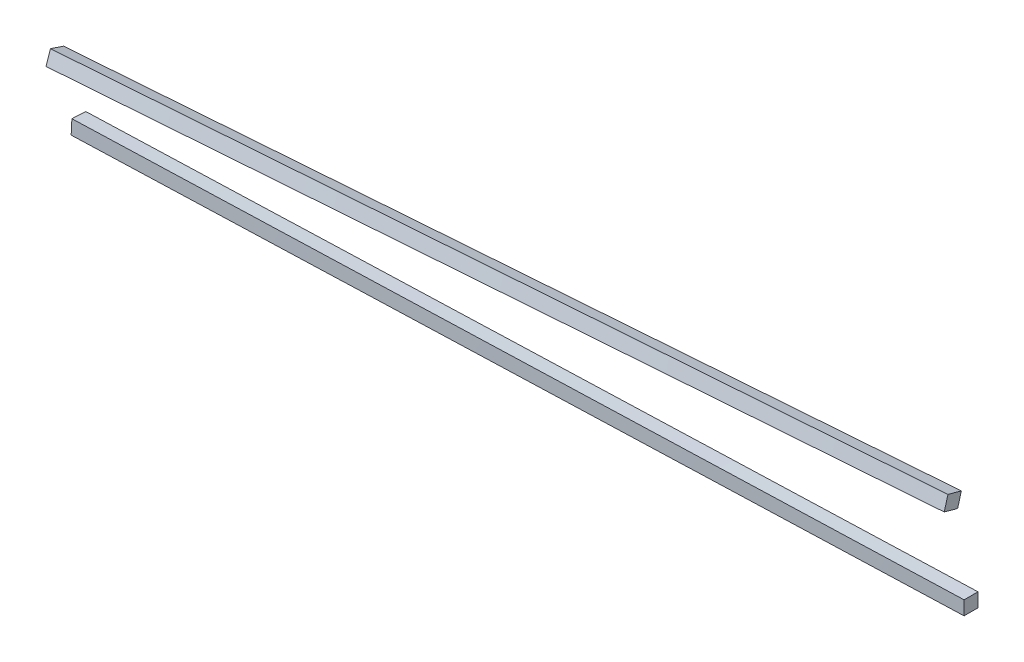
ISO-10303-21;
HEADER;
FILE_DESCRIPTION(('STEP AP214'),'2;1');
FILE_NAME('part.step','',(''),(''),'','','');
FILE_SCHEMA(('AUTOMOTIVE_DESIGN { 1 0 10303 214 1 1 1 1 }'));
ENDSEC;
DATA;
#1=APPLICATION_CONTEXT('core data for automotive mechanical design processes');
#2=APPLICATION_PROTOCOL_DEFINITION('international standard','automotive_design',2000,#1);
#3=PRODUCT_CONTEXT('',#1,'mechanical');
#4=PRODUCT('Part','Part','',(#3));
#5=PRODUCT_RELATED_PRODUCT_CATEGORY('part','',(#4));
#6=PRODUCT_DEFINITION_FORMATION('','',#4);
#7=PRODUCT_DEFINITION_CONTEXT('part definition',#1,'design');
#8=PRODUCT_DEFINITION('design','',#6,#7);
#9=PRODUCT_DEFINITION_SHAPE('','',#8);
#10=(LENGTH_UNIT() NAMED_UNIT(*) SI_UNIT(.MILLI.,.METRE.));
#11=(NAMED_UNIT(*) PLANE_ANGLE_UNIT() SI_UNIT($,.RADIAN.));
#12=(NAMED_UNIT(*) SI_UNIT($,.STERADIAN.) SOLID_ANGLE_UNIT());
#13=UNCERTAINTY_MEASURE_WITH_UNIT(LENGTH_MEASURE(1.E-05),#10,'distance_accuracy_value','');
#14=(GEOMETRIC_REPRESENTATION_CONTEXT(3) GLOBAL_UNCERTAINTY_ASSIGNED_CONTEXT((#13)) GLOBAL_UNIT_ASSIGNED_CONTEXT((#10,
#11,#12)) REPRESENTATION_CONTEXT('',''));
#15=CARTESIAN_POINT('',(0.,0.,0.));
#16=DIRECTION('',(0.,0.,1.));
#17=DIRECTION('',(1.,0.,0.));
#18=AXIS2_PLACEMENT_3D('',#15,#16,#17);
#19=CARTESIAN_POINT('',(-301.244,0.,0.));
#20=DIRECTION('',(1.,0.,0.));
#21=DIRECTION('',(0.,0.,-1.));
#22=AXIS2_PLACEMENT_3D('',#19,#20,#21);
#23=PLANE('',#22);
#24=DIRECTION('',(0.,0.998681754470149,-0.0513298479291129));
#25=VECTOR('',#24,1.);
#26=CARTESIAN_POINT('',(-301.244,-54.3131968202896,-76.6565977528262));
#27=LINE('',#26,#25);
#28=CARTESIAN_POINT('',(-301.244,-54.3131968202896,-76.6565977528262));
#29=VERTEX_POINT('',#28);
#30=CARTESIAN_POINT('',(-301.244,-49.4935586732166,-76.9043155989321));
#31=VERTEX_POINT('',#30);
#32=EDGE_CURVE('E145',#29,#31,#27,.T.);
#33=ORIENTED_EDGE('',*,*,#32,.F.);
#34=DIRECTION('',(0.,0.0513298479291094,0.998681754470149));
#35=VECTOR('',#34,1.);
#36=CARTESIAN_POINT('',(-301.244,-54.3131968202896,-76.6565977528262));
#37=LINE('',#36,#35);
#38=CARTESIAN_POINT('',(-301.244,-54.0654789741837,-71.8369596057533));
#39=VERTEX_POINT('',#38);
#40=EDGE_CURVE('E13',#29,#39,#37,.T.);
#41=ORIENTED_EDGE('',*,*,#40,.T.);
#42=DIRECTION('',(0.,0.998681754470149,-0.0513298479291069));
#43=VECTOR('',#42,1.);
#44=CARTESIAN_POINT('',(-301.244,-54.0654789741837,-71.8369596057533));
#45=LINE('',#44,#43);
#46=CARTESIAN_POINT('',(-301.244,-49.2458408271109,-72.0846774518592));
#47=VERTEX_POINT('',#46);
#48=EDGE_CURVE('E76',#39,#47,#45,.T.);
#49=ORIENTED_EDGE('',*,*,#48,.T.);
#50=DIRECTION('',(0.,0.0513298479290573,0.998681754470151));
#51=VECTOR('',#50,1.);
#52=CARTESIAN_POINT('',(-301.244,-49.4935586732166,-76.9043155989321));
#53=LINE('',#52,#51);
#54=EDGE_CURVE('E142',#31,#47,#53,.T.);
#55=ORIENTED_EDGE('',*,*,#54,.F.);
#56=EDGE_LOOP('',(#33,#41,#49,#55));
#57=FACE_BOUND('',#56,.T.);
#58=ADVANCED_FACE('F65',(#57),#23,.F.);
#59=CARTESIAN_POINT('',(0.,0.,0.));
#60=DIRECTION('',(-1.,0.,0.));
#61=DIRECTION('',(0.,0.,1.));
#62=AXIS2_PLACEMENT_3D('',#59,#60,#61);
#63=PLANE('',#62);
#64=DIRECTION('',(0.,0.999999249764561,-0.00122493686179626));
#65=VECTOR('',#64,1.);
#66=CARTESIAN_POINT('',(0.,-52.3639366169535,-80.6060154079807));
#67=LINE('',#66,#65);
#68=CARTESIAN_POINT('',(0.,-52.3639366169535,-80.6060154079807));
#69=VERTEX_POINT('',#68);
#70=CARTESIAN_POINT('',(0.,-47.5379402375898,-80.6119269532758));
#71=VERTEX_POINT('',#70);
#72=EDGE_CURVE('E115',#69,#71,#67,.T.);
#73=ORIENTED_EDGE('',*,*,#72,.F.);
#74=DIRECTION('',(0.,-0.00122493686179193,-0.999999249764561));
#75=VECTOR('',#74,1.);
#76=CARTESIAN_POINT('',(0.,-52.3639366169535,-80.6060154079807));
#77=LINE('',#76,#75);
#78=CARTESIAN_POINT('',(0.,-52.3698481622485,-85.4320117873445));
#79=VERTEX_POINT('',#78);
#80=EDGE_CURVE('E249',#69,#79,#77,.T.);
#81=ORIENTED_EDGE('',*,*,#80,.T.);
#82=DIRECTION('',(0.,0.999999249764561,-0.00122493686179337));
#83=VECTOR('',#82,1.);
#84=CARTESIAN_POINT('',(0.,-52.3698481622485,-85.4320117873445));
#85=LINE('',#84,#83);
#86=CARTESIAN_POINT('',(0.,-47.5438517828847,-85.4379233326396));
#87=VERTEX_POINT('',#86);
#88=EDGE_CURVE('E117',#79,#87,#85,.T.);
#89=ORIENTED_EDGE('',*,*,#88,.T.);
#90=DIRECTION('',(0.,-0.00122493686178187,-0.999999249764561));
#91=VECTOR('',#90,1.);
#92=CARTESIAN_POINT('',(0.,-47.5379402375898,-80.6119269532758));
#93=LINE('',#92,#91);
#94=EDGE_CURVE('E111',#71,#87,#93,.T.);
#95=ORIENTED_EDGE('',*,*,#94,.F.);
#96=EDGE_LOOP('',(#73,#81,#89,#95));
#97=FACE_BOUND('',#96,.T.);
#98=ADVANCED_FACE('F114',(#97),#63,.F.);
#99=CARTESIAN_POINT('',(0.,-47.5438517828847,-85.4379233326396));
#100=CARTESIAN_POINT('',(-301.244,-49.4935586732166,-76.9043155989321));
#101=CARTESIAN_POINT('',(0.,-48.3481845127787,-85.4369380750904));
#102=CARTESIAN_POINT('',(-301.244,-50.2968316977287,-76.8630292912478));
#103=CARTESIAN_POINT('',(0.,-49.1525172426727,-85.4359528175412));
#104=CARTESIAN_POINT('',(-301.244,-51.1001047222409,-76.8217429835635));
#105=CARTESIAN_POINT('',(0.,-50.7611827024606,-85.4339823024429));
#106=CARTESIAN_POINT('',(-301.244,-52.7066507712652,-76.7391703681949));
#107=CARTESIAN_POINT('',(0.,-51.5655154323546,-85.4329970448937));
#108=CARTESIAN_POINT('',(-301.244,-53.5099237957774,-76.6978840605105));
#109=CARTESIAN_POINT('',(0.,-52.3698481622485,-85.4320117873445));
#110=CARTESIAN_POINT('',(-301.244,-54.3131968202896,-76.6565977528262));
#111=B_SPLINE_SURFACE_WITH_KNOTS('',3,1,((#99,#100),(#101,#102),(#103,#104),(#105,#106),(#107,
#108),(#109,#110)),.UNSPECIFIED.,.F.,.F.,.F.,(4,2,4),(2,2),(0.,0.5,1.),(0.,1.),.UNSPECIFIED.);
#112=DIRECTION('',(-0.999555193249879,-0.00644820890520686,0.0291176278070954));
#113=VECTOR('',#112,1.);
#114=CARTESIAN_POINT('',(-150.622,-53.341522491269,-81.0443047700854));
#115=LINE('',#114,#113);
#116=EDGE_CURVE('E84',#79,#29,#115,.T.);
#117=DIRECTION('',(0.999578087821169,0.00646945428041606,-0.0283159409006493));
#118=VECTOR('',#117,1.);
#119=CARTESIAN_POINT('',(-150.622,-48.5187052280507,-81.1711194657858));
#120=LINE('',#119,#118);
#121=EDGE_CURVE('E160',#31,#87,#120,.T.);
#122=ORIENTED_EDGE('',*,*,#88,.F.);
#123=ORIENTED_EDGE('',*,*,#116,.T.);
#124=ORIENTED_EDGE('',*,*,#32,.T.);
#125=ORIENTED_EDGE('',*,*,#121,.T.);
#126=EDGE_LOOP('',(#122,#123,#124,#125));
#127=FACE_BOUND('',#126,.T.);
#128=ADVANCED_FACE('F201',(#127),#111,.T.);
#129=CARTESIAN_POINT('',(0.,-52.3698481622485,-85.4320117873445));
#130=CARTESIAN_POINT('',(-301.244,-54.3131968202896,-76.6565977528262));
#131=CARTESIAN_POINT('',(0.,-52.3688629046993,-84.6276790574505));
#132=CARTESIAN_POINT('',(-301.244,-54.2719105126053,-75.8533247283141));
#133=CARTESIAN_POINT('',(0.,-52.3678776471502,-83.8233463275565));
#134=CARTESIAN_POINT('',(-301.244,-54.2306242049209,-75.0500517038019));
#135=CARTESIAN_POINT('',(0.,-52.3659071320518,-82.2146808677686));
#136=CARTESIAN_POINT('',(-301.244,-54.1480515895523,-73.4435056547776));
#137=CARTESIAN_POINT('',(0.,-52.3649218745027,-81.4103481378746));
#138=CARTESIAN_POINT('',(-301.244,-54.106765281868,-72.6402326302655));
#139=CARTESIAN_POINT('',(0.,-52.3639366169535,-80.6060154079807));
#140=CARTESIAN_POINT('',(-301.244,-54.0654789741837,-71.8369596057533));
#141=B_SPLINE_SURFACE_WITH_KNOTS('',3,1,((#129,#130),(#131,#132),(#133,#134),(#135,#136),(#137,
#138),(#139,#140)),.UNSPECIFIED.,.F.,.F.,.F.,(4,2,4),(2,2),(0.,0.5,1.),(0.,1.),.UNSPECIFIED.);
#142=DIRECTION('',(-0.999560656696797,-0.00564590430345644,0.0290966896478778));
#143=VECTOR('',#142,1.);
#144=CARTESIAN_POINT('',(-150.622,-53.2147077955686,-76.221487506867));
#145=LINE('',#144,#143);
#146=EDGE_CURVE('E134',#69,#39,#145,.T.);
#147=ORIENTED_EDGE('',*,*,#80,.F.);
#148=ORIENTED_EDGE('',*,*,#146,.T.);
#149=ORIENTED_EDGE('',*,*,#40,.F.);
#150=ORIENTED_EDGE('',*,*,#116,.F.);
#151=EDGE_LOOP('',(#147,#148,#149,#150));
#152=FACE_BOUND('',#151,.T.);
#153=ADVANCED_FACE('F172',(#152),#141,.T.);
#154=CARTESIAN_POINT('',(0.,-47.5379402375898,-80.6119269532758));
#155=CARTESIAN_POINT('',(-301.244,-49.2458408271109,-72.0846774518592));
#156=CARTESIAN_POINT('',(0.,-47.5389254951389,-81.4162596831702));
#157=CARTESIAN_POINT('',(-301.244,-49.2871271347952,-72.8879504763713));
#158=CARTESIAN_POINT('',(0.,-47.5399107526881,-82.2205924130644));
#159=CARTESIAN_POINT('',(-301.244,-49.3284134424795,-73.6912235008835));
#160=CARTESIAN_POINT('',(0.,-47.5418812677864,-83.8292578728523));
#161=CARTESIAN_POINT('',(-301.244,-49.410986057848,-75.2977695499078));
#162=CARTESIAN_POINT('',(0.,-47.5428665253356,-84.6335906027461));
#163=CARTESIAN_POINT('',(-301.244,-49.4522723655323,-76.10104257442));
#164=CARTESIAN_POINT('',(0.,-47.5438517828847,-85.4379233326396));
#165=CARTESIAN_POINT('',(-301.244,-49.4935586732166,-76.9043155989321));
#166=B_SPLINE_SURFACE_WITH_KNOTS('',3,1,((#154,#155),(#156,#157),(#158,#159),(#160,#161),(#162,
#163),(#164,#165)),.UNSPECIFIED.,.F.,.F.,.F.,(4,2,4),(2,2),(0.,0.5,1.),(0.,1.),.UNSPECIFIED.);
#167=DIRECTION('',(-0.999583551643514,-0.00566713141880874,0.028294997883365));
#168=VECTOR('',#167,1.);
#169=CARTESIAN_POINT('',(-150.622,-48.3918905323504,-76.3483022025675));
#170=LINE('',#169,#168);
#171=EDGE_CURVE('E132',#71,#47,#170,.T.);
#172=ORIENTED_EDGE('',*,*,#94,.T.);
#173=ORIENTED_EDGE('',*,*,#121,.F.);
#174=ORIENTED_EDGE('',*,*,#54,.T.);
#175=ORIENTED_EDGE('',*,*,#171,.F.);
#176=EDGE_LOOP('',(#172,#173,#174,#175));
#177=FACE_BOUND('',#176,.T.);
#178=ADVANCED_FACE('F141',(#177),#166,.T.);
#179=CARTESIAN_POINT('',(0.,-52.3639366169535,-80.6060154079807));
#180=CARTESIAN_POINT('',(-301.244,-54.0654789741837,-71.8369596057533));
#181=CARTESIAN_POINT('',(0.,-51.5596038870595,-80.6070006655299));
#182=CARTESIAN_POINT('',(-301.244,-53.2622059496716,-71.8782459134376));
#183=CARTESIAN_POINT('',(0.,-50.7552711571656,-80.6079859230791));
#184=CARTESIAN_POINT('',(-301.244,-52.4589329251595,-71.9195322211219));
#185=CARTESIAN_POINT('',(0.,-49.1466056973777,-80.6099564381774));
#186=CARTESIAN_POINT('',(-301.244,-50.8523868761353,-72.0021048364905));
#187=CARTESIAN_POINT('',(0.,-48.3422729674837,-80.6109416957266));
#188=CARTESIAN_POINT('',(-301.244,-50.0491138516231,-72.0433911441748));
#189=CARTESIAN_POINT('',(0.,-47.5379402375898,-80.6119269532758));
#190=CARTESIAN_POINT('',(-301.244,-49.2458408271109,-72.0846774518592));
#191=B_SPLINE_SURFACE_WITH_KNOTS('',3,1,((#179,#180),(#181,#182),(#183,#184),(#185,#186),(#187,
#188),(#189,#190)),.UNSPECIFIED.,.F.,.F.,.F.,(4,2,4),(2,2),(0.,0.5,1.),(0.,1.),.UNSPECIFIED.);
#192=ORIENTED_EDGE('',*,*,#72,.T.);
#193=ORIENTED_EDGE('',*,*,#171,.T.);
#194=ORIENTED_EDGE('',*,*,#48,.F.);
#195=ORIENTED_EDGE('',*,*,#146,.F.);
#196=EDGE_LOOP('',(#192,#193,#194,#195));
#197=FACE_BOUND('',#196,.T.);
#198=ADVANCED_FACE('F131',(#197),#191,.T.);
#199=CLOSED_SHELL('',(#58,#98,#128,#153,#178,#198));
#200=MANIFOLD_SOLID_BREP('B2',#199);
#201=CARTESIAN_POINT('',(-301.244,0.,0.));
#202=DIRECTION('',(1.,0.,0.));
#203=DIRECTION('',(0.,0.,-1.));
#204=AXIS2_PLACEMENT_3D('',#201,#202,#203);
#205=PLANE('',#204);
#206=DIRECTION('',(0.,0.948597586448129,-0.316484784760317));
#207=VECTOR('',#206,1.);
#208=CARTESIAN_POINT('',(-301.244,-30.5643098408637,-67.6798509574859));
#209=LINE('',#208,#207);
#210=CARTESIAN_POINT('',(-301.244,-30.5643098408637,-67.6798509574859));
#211=VERTEX_POINT('',#210);
#212=CARTESIAN_POINT('',(-301.244,-25.986377888665,-69.2072065287391));
#213=VERTEX_POINT('',#212);
#214=EDGE_CURVE('E538',#211,#213,#209,.T.);
#215=ORIENTED_EDGE('',*,*,#214,.F.);
#216=DIRECTION('',(0.,0.316484784760316,0.948597586448129));
#217=VECTOR('',#216,1.);
#218=CARTESIAN_POINT('',(-301.244,-30.5643098408637,-67.6798509574859));
#219=LINE('',#218,#217);
#220=CARTESIAN_POINT('',(-301.244,-29.0369542696104,-63.1019190052872));
#221=VERTEX_POINT('',#220);
#222=EDGE_CURVE('E63',#211,#221,#219,.T.);
#223=ORIENTED_EDGE('',*,*,#222,.T.);
#224=DIRECTION('',(0.,0.948597586448129,-0.316484784760317));
#225=VECTOR('',#224,1.);
#226=CARTESIAN_POINT('',(-301.244,-29.0369542696104,-63.1019190052872));
#227=LINE('',#226,#225);
#228=CARTESIAN_POINT('',(-301.244,-24.4590223174117,-64.6292745765404));
#229=VERTEX_POINT('',#228);
#230=EDGE_CURVE('E423',#221,#229,#227,.T.);
#231=ORIENTED_EDGE('',*,*,#230,.T.);
#232=DIRECTION('',(0.,0.316484784760317,0.948597586448129));
#233=VECTOR('',#232,1.);
#234=CARTESIAN_POINT('',(-301.244,-25.986377888665,-69.2072065287391));
#235=LINE('',#234,#233);
#236=EDGE_CURVE('E465',#213,#229,#235,.T.);
#237=ORIENTED_EDGE('',*,*,#236,.F.);
#238=EDGE_LOOP('',(#215,#223,#231,#237));
#239=FACE_BOUND('',#238,.T.);
#240=ADVANCED_FACE('F413',(#239),#205,.F.);
#241=CARTESIAN_POINT('',(0.,0.,0.));
#242=DIRECTION('',(1.,0.,0.));
#243=DIRECTION('',(0.,0.,-1.));
#244=AXIS2_PLACEMENT_3D('',#241,#242,#243);
#245=PLANE('',#244);
#246=DIRECTION('',(0.,-0.264944987657992,-0.964263529080565));
#247=VECTOR('',#246,1.);
#248=CARTESIAN_POINT('',(0.,-17.6892857922132,-73.7225928427553));
#249=LINE('',#248,#247);
#250=CARTESIAN_POINT('',(0.,-17.6892857922132,-73.7225928427553));
#251=VERTEX_POINT('',#250);
#252=CARTESIAN_POINT('',(0.,-18.9679103026507,-78.3761286340981));
#253=VERTEX_POINT('',#252);
#254=EDGE_CURVE('E526',#251,#253,#249,.T.);
#255=ORIENTED_EDGE('',*,*,#254,.T.);
#256=DIRECTION('',(0.,0.964263529080565,-0.264944987657993));
#257=VECTOR('',#256,1.);
#258=CARTESIAN_POINT('',(0.,-18.9679103026507,-78.3761286340981));
#259=LINE('',#258,#257);
#260=CARTESIAN_POINT('',(0.,-14.3143745113079,-79.6547531445356));
#261=VERTEX_POINT('',#260);
#262=EDGE_CURVE('E485',#253,#261,#259,.T.);
#263=ORIENTED_EDGE('',*,*,#262,.T.);
#264=DIRECTION('',(0.,-0.264944987657993,-0.964263529080565));
#265=VECTOR('',#264,1.);
#266=CARTESIAN_POINT('',(0.,-13.0357500008704,-75.0012173531927));
#267=LINE('',#266,#265);
#268=CARTESIAN_POINT('',(0.,-13.0357500008704,-75.0012173531927));
#269=VERTEX_POINT('',#268);
#270=EDGE_CURVE('E462',#269,#261,#267,.T.);
#271=ORIENTED_EDGE('',*,*,#270,.F.);
#272=DIRECTION('',(0.,0.964263529080565,-0.264944987657993));
#273=VECTOR('',#272,1.);
#274=CARTESIAN_POINT('',(0.,-17.6892857922132,-73.7225928427553));
#275=LINE('',#274,#273);
#276=EDGE_CURVE('E469',#251,#269,#275,.T.);
#277=ORIENTED_EDGE('',*,*,#276,.F.);
#278=EDGE_LOOP('',(#255,#263,#271,#277));
#279=FACE_BOUND('',#278,.T.);
#280=ADVANCED_FACE('F484',(#279),#245,.T.);
#281=CARTESIAN_POINT('',(0.,-13.0357500008704,-75.0012173531927));
#282=CARTESIAN_POINT('',(-301.244,-24.4590223174117,-64.6292745765404));
#283=CARTESIAN_POINT('',(0.,-13.2488540859433,-75.7768066517498));
#284=CARTESIAN_POINT('',(-301.244,-24.7135815792873,-65.3922632352402));
#285=CARTESIAN_POINT('',(0.,-13.4619581710162,-76.5523959503069));
#286=CARTESIAN_POINT('',(-301.244,-24.9681408411628,-66.15525189394));
#287=CARTESIAN_POINT('',(0.,-13.888166341162,-78.1035745474211));
#288=CARTESIAN_POINT('',(-301.244,-25.4772593649139,-67.6812292113396));
#289=CARTESIAN_POINT('',(0.,-14.1012704262349,-78.8791638459783));
#290=CARTESIAN_POINT('',(-301.244,-25.7318186267895,-68.4442178700394));
#291=CARTESIAN_POINT('',(0.,-14.3143745113079,-79.6547531445356));
#292=CARTESIAN_POINT('',(-301.244,-25.986377888665,-69.2072065287391));
#293=B_SPLINE_SURFACE_WITH_KNOTS('',3,1,((#281,#282),(#283,#284),(#285,#286),(#287,#288),(#289,
#290),(#291,#292)),.UNSPECIFIED.,.F.,.F.,.F.,(4,2,4),(2,2),(0.,0.5,1.),(0.,1.),.UNSPECIFIED.);
#294=DIRECTION('',(-0.99865071131137,-0.0386937315771483,0.0346345482709159));
#295=VECTOR('',#294,1.);
#296=CARTESIAN_POINT('',(-150.622,-20.1503761999865,-74.4309798366373));
#297=LINE('',#296,#295);
#298=EDGE_CURVE('E468',#261,#213,#297,.T.);
#299=DIRECTION('',(0.998690874208296,0.0378706889303227,-0.0343852976286774));
#300=VECTOR('',#299,1.);
#301=CARTESIAN_POINT('',(-150.622,-18.7473861591411,-69.8152459648666));
#302=LINE('',#301,#300);
#303=EDGE_CURVE('E457',#229,#269,#302,.T.);
#304=ORIENTED_EDGE('',*,*,#270,.T.);
#305=ORIENTED_EDGE('',*,*,#298,.T.);
#306=ORIENTED_EDGE('',*,*,#236,.T.);
#307=ORIENTED_EDGE('',*,*,#303,.T.);
#308=EDGE_LOOP('',(#304,#305,#306,#307));
#309=FACE_BOUND('',#308,.T.);
#310=ADVANCED_FACE('F459',(#309),#293,.T.);
#311=CARTESIAN_POINT('',(0.,-14.3143745113079,-79.6547531445356));
#312=CARTESIAN_POINT('',(-301.244,-25.986377888665,-69.2072065287391));
#313=CARTESIAN_POINT('',(0.,-15.089963809865,-79.4416490594627));
#314=CARTESIAN_POINT('',(-301.244,-26.7493665473648,-68.9526472668636));
#315=CARTESIAN_POINT('',(0.,-15.8655531084221,-79.2285449743897));
#316=CARTESIAN_POINT('',(-301.244,-27.5123552060646,-68.698088004988));
#317=CARTESIAN_POINT('',(0.,-17.4167317055364,-78.8023368042439));
#318=CARTESIAN_POINT('',(-301.244,-29.0383325234642,-68.1889694812369));
#319=CARTESIAN_POINT('',(0.,-18.1923210040935,-78.589232719171));
#320=CARTESIAN_POINT('',(-301.244,-29.8013211821639,-67.9344102193614));
#321=CARTESIAN_POINT('',(0.,-18.9679103026507,-78.3761286340981));
#322=CARTESIAN_POINT('',(-301.244,-30.5643098408637,-67.6798509574859));
#323=B_SPLINE_SURFACE_WITH_KNOTS('',3,1,((#311,#312),(#313,#314),(#315,#316),(#317,#318),(#319,
#320),(#321,#322)),.UNSPECIFIED.,.F.,.F.,.F.,(4,2,4),(2,2),(0.,0.5,1.),(0.,1.),.UNSPECIFIED.);
#324=DIRECTION('',(-0.998631505937625,-0.0384423587998436,0.0354584319824537));
#325=VECTOR('',#324,1.);
#326=CARTESIAN_POINT('',(-150.622,-24.7661100717572,-73.027989795792));
#327=LINE('',#326,#325);
#328=EDGE_CURVE('E431',#253,#211,#327,.T.);
#329=ORIENTED_EDGE('',*,*,#262,.F.);
#330=ORIENTED_EDGE('',*,*,#328,.T.);
#331=ORIENTED_EDGE('',*,*,#214,.T.);
#332=ORIENTED_EDGE('',*,*,#298,.F.);
#333=EDGE_LOOP('',(#329,#330,#331,#332));
#334=FACE_BOUND('',#333,.T.);
#335=ADVANCED_FACE('F587',(#334),#323,.T.);
#336=CARTESIAN_POINT('',(0.,-17.6892857922132,-73.7225928427553));
#337=CARTESIAN_POINT('',(-301.244,-29.0369542696104,-63.1019190052872));
#338=CARTESIAN_POINT('',(0.,-16.9136964936561,-73.9356969278282));
#339=CARTESIAN_POINT('',(-301.244,-28.2739656109106,-63.3564782671627));
#340=CARTESIAN_POINT('',(0.,-16.1381071950989,-74.1488010129011));
#341=CARTESIAN_POINT('',(-301.244,-27.5109769522109,-63.6110375290382));
#342=CARTESIAN_POINT('',(0.,-14.5869285979847,-74.5750091830469));
#343=CARTESIAN_POINT('',(-301.244,-25.9849996348113,-64.1201560527893));
#344=CARTESIAN_POINT('',(0.,-13.8113392994275,-74.7881132681198));
#345=CARTESIAN_POINT('',(-301.244,-25.2220109761115,-64.3747153146649));
#346=CARTESIAN_POINT('',(0.,-13.0357500008704,-75.0012173531927));
#347=CARTESIAN_POINT('',(-301.244,-24.4590223174117,-64.6292745765404));
#348=B_SPLINE_SURFACE_WITH_KNOTS('',3,1,((#336,#337),(#338,#339),(#340,#341),(#342,#343),(#344,
#345),(#346,#347)),.UNSPECIFIED.,.F.,.F.,.F.,(4,2,4),(2,2),(0.,0.5,1.),(0.,1.),.UNSPECIFIED.);
#349=DIRECTION('',(-0.998671666517346,-0.0376193218434513,0.035209219240222));
#350=VECTOR('',#349,1.);
#351=CARTESIAN_POINT('',(-150.622,-23.3631200309118,-68.4122559240212));
#352=LINE('',#351,#350);
#353=EDGE_CURVE('E475',#251,#221,#352,.T.);
#354=ORIENTED_EDGE('',*,*,#276,.T.);
#355=ORIENTED_EDGE('',*,*,#303,.F.);
#356=ORIENTED_EDGE('',*,*,#230,.F.);
#357=ORIENTED_EDGE('',*,*,#353,.F.);
#358=EDGE_LOOP('',(#354,#355,#356,#357));
#359=FACE_BOUND('',#358,.T.);
#360=ADVANCED_FACE('F473',(#359),#348,.T.);
#361=CARTESIAN_POINT('',(0.,-18.9679103026507,-78.3761286340981));
#362=CARTESIAN_POINT('',(-301.244,-30.5643098408637,-67.6798509574859));
#363=CARTESIAN_POINT('',(0.,-18.7548062175778,-77.600539335541));
#364=CARTESIAN_POINT('',(-301.244,-30.3097505789882,-66.916862298786));
#365=CARTESIAN_POINT('',(0.,-18.5417021325049,-76.8249500369839));
#366=CARTESIAN_POINT('',(-301.244,-30.0551913171126,-66.1538736400862));
#367=CARTESIAN_POINT('',(0.,-18.115493962359,-75.2737714398696));
#368=CARTESIAN_POINT('',(-301.244,-29.5460727933615,-64.6278963226867));
#369=CARTESIAN_POINT('',(0.,-17.9023898772861,-74.4981821413124));
#370=CARTESIAN_POINT('',(-301.244,-29.291513531486,-63.8649076639869));
#371=CARTESIAN_POINT('',(0.,-17.6892857922132,-73.7225928427553));
#372=CARTESIAN_POINT('',(-301.244,-29.0369542696104,-63.1019190052872));
#373=B_SPLINE_SURFACE_WITH_KNOTS('',3,1,((#361,#362),(#363,#364),(#365,#366),(#367,#368),(#369,
#370),(#371,#372)),.UNSPECIFIED.,.F.,.F.,.F.,(4,2,4),(2,2),(0.,0.5,1.),(0.,1.),.UNSPECIFIED.);
#374=ORIENTED_EDGE('',*,*,#254,.F.);
#375=ORIENTED_EDGE('',*,*,#353,.T.);
#376=ORIENTED_EDGE('',*,*,#222,.F.);
#377=ORIENTED_EDGE('',*,*,#328,.F.);
#378=EDGE_LOOP('',(#374,#375,#376,#377));
#379=FACE_BOUND('',#378,.T.);
#380=ADVANCED_FACE('F638',(#379),#373,.T.);
#381=CLOSED_SHELL('',(#240,#280,#310,#335,#360,#380));
#382=MANIFOLD_SOLID_BREP('B7',#381);
#383=ADVANCED_BREP_SHAPE_REPRESENTATION('',(#18,#200,#382),#14);
#384=SHAPE_DEFINITION_REPRESENTATION(#9,#383);
ENDSEC;
END-ISO-10303-21;
